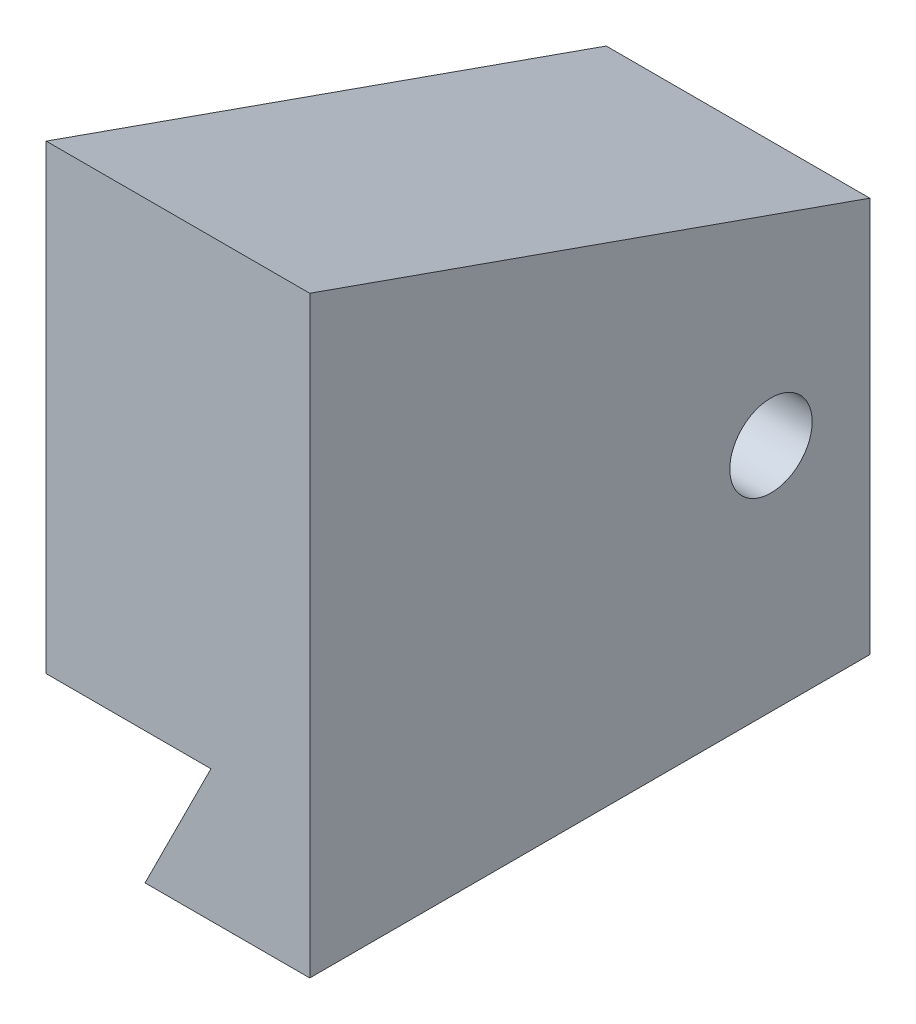
ISO-10303-21;
HEADER;
FILE_DESCRIPTION(('STEP AP214'),'2;1');
FILE_NAME('part.step','',(''),(''),'','','');
FILE_SCHEMA(('AUTOMOTIVE_DESIGN { 1 0 10303 214 1 1 1 1 }'));
ENDSEC;
DATA;
#1=APPLICATION_CONTEXT('core data for automotive mechanical design processes');
#2=APPLICATION_PROTOCOL_DEFINITION('international standard','automotive_design',2000,#1);
#3=PRODUCT_CONTEXT('',#1,'mechanical');
#4=PRODUCT('Part','Part','',(#3));
#5=PRODUCT_RELATED_PRODUCT_CATEGORY('part','',(#4));
#6=PRODUCT_DEFINITION_FORMATION('','',#4);
#7=PRODUCT_DEFINITION_CONTEXT('part definition',#1,'design');
#8=PRODUCT_DEFINITION('design','',#6,#7);
#9=PRODUCT_DEFINITION_SHAPE('','',#8);
#10=(LENGTH_UNIT() NAMED_UNIT(*) SI_UNIT(.MILLI.,.METRE.));
#11=(NAMED_UNIT(*) PLANE_ANGLE_UNIT() SI_UNIT($,.RADIAN.));
#12=(NAMED_UNIT(*) SI_UNIT($,.STERADIAN.) SOLID_ANGLE_UNIT());
#13=UNCERTAINTY_MEASURE_WITH_UNIT(LENGTH_MEASURE(1.E-05),#10,'distance_accuracy_value','');
#14=(GEOMETRIC_REPRESENTATION_CONTEXT(3) GLOBAL_UNCERTAINTY_ASSIGNED_CONTEXT((#13)) GLOBAL_UNIT_ASSIGNED_CONTEXT((#10,
#11,#12)) REPRESENTATION_CONTEXT('',''));
#15=CARTESIAN_POINT('',(0.,0.,0.));
#16=DIRECTION('',(0.,0.,1.));
#17=DIRECTION('',(1.,0.,0.));
#18=AXIS2_PLACEMENT_3D('',#15,#16,#17);
#19=CARTESIAN_POINT('',(8.,0.,17.));
#20=DIRECTION('',(0.,1.,0.));
#21=DIRECTION('',(0.,0.,1.));
#22=AXIS2_PLACEMENT_3D('',#19,#20,#21);
#23=PLANE('',#22);
#24=DIRECTION('',(0.,0.,-1.));
#25=VECTOR('',#24,1.);
#26=CARTESIAN_POINT('',(0.,0.,17.));
#27=LINE('',#26,#25);
#28=CARTESIAN_POINT('',(0.,0.,17.));
#29=VERTEX_POINT('',#28);
#30=CARTESIAN_POINT('',(0.,0.,0.));
#31=VERTEX_POINT('',#30);
#32=EDGE_CURVE('E136',#29,#31,#27,.T.);
#33=ORIENTED_EDGE('',*,*,#32,.F.);
#34=DIRECTION('',(-1.,0.,0.));
#35=VECTOR('',#34,1.);
#36=CARTESIAN_POINT('',(8.,0.,17.));
#37=LINE('',#36,#35);
#38=CARTESIAN_POINT('',(-5.,0.,17.));
#39=VERTEX_POINT('',#38);
#40=EDGE_CURVE('E101',#29,#39,#37,.T.);
#41=ORIENTED_EDGE('',*,*,#40,.T.);
#42=DIRECTION('',(0.,0.,-1.));
#43=VECTOR('',#42,1.);
#44=CARTESIAN_POINT('',(-5.,0.,17.));
#45=LINE('',#44,#43);
#46=CARTESIAN_POINT('',(-5.,0.,0.));
#47=VERTEX_POINT('',#46);
#48=EDGE_CURVE('E117',#39,#47,#45,.T.);
#49=ORIENTED_EDGE('',*,*,#48,.T.);
#50=DIRECTION('',(-1.,0.,0.));
#51=VECTOR('',#50,1.);
#52=CARTESIAN_POINT('',(8.,0.,0.));
#53=LINE('',#52,#51);
#54=EDGE_CURVE('E11',#31,#47,#53,.T.);
#55=ORIENTED_EDGE('',*,*,#54,.F.);
#56=EDGE_LOOP('',(#33,#41,#49,#55));
#57=FACE_BOUND('',#56,.T.);
#58=ADVANCED_FACE('F35',(#57),#23,.F.);
#59=CARTESIAN_POINT('',(8.,0.,0.));
#60=DIRECTION('',(0.,0.,1.));
#61=DIRECTION('',(1.,0.,0.));
#62=AXIS2_PLACEMENT_3D('',#59,#60,#61);
#63=PLANE('',#62);
#64=DIRECTION('',(0.,1.,0.));
#65=VECTOR('',#64,1.);
#66=CARTESIAN_POINT('',(0.,0.,0.));
#67=LINE('',#66,#65);
#68=CARTESIAN_POINT('',(0.,12.,0.));
#69=VERTEX_POINT('',#68);
#70=EDGE_CURVE('E50',#31,#69,#67,.T.);
#71=ORIENTED_EDGE('',*,*,#70,.F.);
#72=ORIENTED_EDGE('',*,*,#54,.T.);
#73=DIRECTION('',(0.447213595499958,0.894427190999916,0.));
#74=VECTOR('',#73,1.);
#75=CARTESIAN_POINT('',(-5.,0.,0.));
#76=LINE('',#75,#74);
#77=CARTESIAN_POINT('',(-3.,4.,0.));
#78=VERTEX_POINT('',#77);
#79=EDGE_CURVE('E125',#47,#78,#76,.T.);
#80=ORIENTED_EDGE('',*,*,#79,.T.);
#81=DIRECTION('',(-1.,0.,0.));
#82=VECTOR('',#81,1.);
#83=CARTESIAN_POINT('',(-3.,4.,0.));
#84=LINE('',#83,#82);
#85=CARTESIAN_POINT('',(-8.,4.,0.));
#86=VERTEX_POINT('',#85);
#87=EDGE_CURVE('E128',#78,#86,#84,.T.);
#88=ORIENTED_EDGE('',*,*,#87,.T.);
#89=DIRECTION('',(0.,1.,0.));
#90=VECTOR('',#89,1.);
#91=CARTESIAN_POINT('',(-8.,0.,0.));
#92=LINE('',#91,#90);
#93=CARTESIAN_POINT('',(-8.,12.,0.));
#94=VERTEX_POINT('',#93);
#95=EDGE_CURVE('E109',#86,#94,#92,.T.);
#96=ORIENTED_EDGE('',*,*,#95,.T.);
#97=DIRECTION('',(-1.,0.,0.));
#98=VECTOR('',#97,1.);
#99=CARTESIAN_POINT('',(8.,12.,0.));
#100=LINE('',#99,#98);
#101=EDGE_CURVE('E43',#69,#94,#100,.T.);
#102=ORIENTED_EDGE('',*,*,#101,.F.);
#103=EDGE_LOOP('',(#71,#72,#80,#88,#96,#102));
#104=FACE_BOUND('',#103,.T.);
#105=ADVANCED_FACE('F141',(#104),#63,.F.);
#106=CARTESIAN_POINT('',(8.,18.,17.));
#107=DIRECTION('',(0.,0.,-1.));
#108=DIRECTION('',(0.,1.,0.));
#109=AXIS2_PLACEMENT_3D('',#106,#107,#108);
#110=PLANE('',#109);
#111=DIRECTION('',(0.,-1.,0.));
#112=VECTOR('',#111,1.);
#113=CARTESIAN_POINT('',(0.,18.,17.));
#114=LINE('',#113,#112);
#115=CARTESIAN_POINT('',(0.,18.,17.));
#116=VERTEX_POINT('',#115);
#117=EDGE_CURVE('E88',#116,#29,#114,.T.);
#118=ORIENTED_EDGE('',*,*,#117,.F.);
#119=DIRECTION('',(-1.,0.,0.));
#120=VECTOR('',#119,1.);
#121=CARTESIAN_POINT('',(8.,18.,17.));
#122=LINE('',#121,#120);
#123=CARTESIAN_POINT('',(-8.,18.,17.));
#124=VERTEX_POINT('',#123);
#125=EDGE_CURVE('E98',#116,#124,#122,.T.);
#126=ORIENTED_EDGE('',*,*,#125,.T.);
#127=DIRECTION('',(0.,-1.,0.));
#128=VECTOR('',#127,1.);
#129=CARTESIAN_POINT('',(-8.,18.,17.));
#130=LINE('',#129,#128);
#131=CARTESIAN_POINT('',(-8.,4.,17.));
#132=VERTEX_POINT('',#131);
#133=EDGE_CURVE('E115',#124,#132,#130,.T.);
#134=ORIENTED_EDGE('',*,*,#133,.T.);
#135=DIRECTION('',(-1.,0.,0.));
#136=VECTOR('',#135,1.);
#137=CARTESIAN_POINT('',(-3.,4.,17.));
#138=LINE('',#137,#136);
#139=CARTESIAN_POINT('',(-3.,4.,17.));
#140=VERTEX_POINT('',#139);
#141=EDGE_CURVE('E58',#140,#132,#138,.T.);
#142=ORIENTED_EDGE('',*,*,#141,.F.);
#143=DIRECTION('',(0.447213595499958,0.894427190999916,0.));
#144=VECTOR('',#143,1.);
#145=CARTESIAN_POINT('',(-5.,0.,17.));
#146=LINE('',#145,#144);
#147=EDGE_CURVE('E121',#39,#140,#146,.T.);
#148=ORIENTED_EDGE('',*,*,#147,.F.);
#149=ORIENTED_EDGE('',*,*,#40,.F.);
#150=EDGE_LOOP('',(#118,#126,#134,#142,#148,#149));
#151=FACE_BOUND('',#150,.T.);
#152=ADVANCED_FACE('F96',(#151),#110,.F.);
#153=CARTESIAN_POINT('',(8.,12.,0.));
#154=DIRECTION('',(0.,-0.94299033358289,0.332820117735137));
#155=DIRECTION('',(0.,-0.332820117735137,-0.94299033358289));
#156=AXIS2_PLACEMENT_3D('',#153,#154,#155);
#157=PLANE('',#156);
#158=DIRECTION('',(0.,0.332820117735137,0.94299033358289));
#159=VECTOR('',#158,1.);
#160=CARTESIAN_POINT('',(0.,12.,0.));
#161=LINE('',#160,#159);
#162=EDGE_CURVE('E85',#69,#116,#161,.T.);
#163=ORIENTED_EDGE('',*,*,#162,.F.);
#164=ORIENTED_EDGE('',*,*,#101,.T.);
#165=DIRECTION('',(0.,0.332820117735137,0.94299033358289));
#166=VECTOR('',#165,1.);
#167=CARTESIAN_POINT('',(-8.,12.,0.));
#168=LINE('',#167,#166);
#169=EDGE_CURVE('E106',#94,#124,#168,.T.);
#170=ORIENTED_EDGE('',*,*,#169,.T.);
#171=ORIENTED_EDGE('',*,*,#125,.F.);
#172=EDGE_LOOP('',(#163,#164,#170,#171));
#173=FACE_BOUND('',#172,.T.);
#174=ADVANCED_FACE('F104',(#173),#157,.F.);
#175=CARTESIAN_POINT('',(8.,7.,3.));
#176=DIRECTION('',(1.,0.,0.));
#177=DIRECTION('',(0.,0.,-1.));
#178=AXIS2_PLACEMENT_3D('',#175,#176,#177);
#179=CYLINDRICAL_SURFACE('',#178,1.24999999999999);
#180=CARTESIAN_POINT('',(-8.,7.,3.));
#181=DIRECTION('',(-1.,0.,0.));
#182=DIRECTION('',(0.,0.,1.));
#183=AXIS2_PLACEMENT_3D('',#180,#181,#182);
#184=CIRCLE('',#183,1.24999999999999);
#185=CARTESIAN_POINT('',(-8.,7.,4.24999999999999));
#186=VERTEX_POINT('',#185);
#187=EDGE_CURVE('E131',#186,#186,#184,.T.);
#188=ORIENTED_EDGE('',*,*,#187,.T.);
#189=EDGE_LOOP('',(#188));
#190=FACE_BOUND('',#189,.T.);
#191=CARTESIAN_POINT('',(0.,7.,3.));
#192=DIRECTION('',(1.,0.,0.));
#193=DIRECTION('',(0.,0.,-1.));
#194=AXIS2_PLACEMENT_3D('',#191,#192,#193);
#195=CIRCLE('',#194,1.24999999999999);
#196=CARTESIAN_POINT('',(0.,7.,1.75000000000001));
#197=VERTEX_POINT('',#196);
#198=EDGE_CURVE('E38',#197,#197,#195,.F.);
#199=ORIENTED_EDGE('',*,*,#198,.F.);
#200=EDGE_LOOP('',(#199));
#201=FACE_BOUND('',#200,.T.);
#202=ADVANCED_FACE('F171',(#190,#201),#179,.F.);
#203=CARTESIAN_POINT('',(-8.,0.,0.));
#204=DIRECTION('',(-1.,0.,0.));
#205=DIRECTION('',(0.,0.,-1.));
#206=AXIS2_PLACEMENT_3D('',#203,#204,#205);
#207=PLANE('',#206);
#208=ORIENTED_EDGE('',*,*,#187,.F.);
#209=EDGE_LOOP('',(#208));
#210=FACE_BOUND('',#209,.T.);
#211=ORIENTED_EDGE('',*,*,#95,.F.);
#212=DIRECTION('',(0.,0.,-1.));
#213=VECTOR('',#212,1.);
#214=CARTESIAN_POINT('',(-8.,4.,17.));
#215=LINE('',#214,#213);
#216=EDGE_CURVE('E118',#132,#86,#215,.T.);
#217=ORIENTED_EDGE('',*,*,#216,.F.);
#218=ORIENTED_EDGE('',*,*,#133,.F.);
#219=ORIENTED_EDGE('',*,*,#169,.F.);
#220=EDGE_LOOP('',(#211,#217,#218,#219));
#221=FACE_BOUND('',#220,.T.);
#222=ADVANCED_FACE('F148',(#210,#221),#207,.T.);
#223=CARTESIAN_POINT('',(-5.,0.,17.));
#224=DIRECTION('',(-0.894427190999916,0.447213595499958,0.));
#225=DIRECTION('',(-0.447213595499958,-0.894427190999916,0.));
#226=AXIS2_PLACEMENT_3D('',#223,#224,#225);
#227=PLANE('',#226);
#228=ORIENTED_EDGE('',*,*,#79,.F.);
#229=ORIENTED_EDGE('',*,*,#48,.F.);
#230=ORIENTED_EDGE('',*,*,#147,.T.);
#231=DIRECTION('',(0.,0.,-1.));
#232=VECTOR('',#231,1.);
#233=CARTESIAN_POINT('',(-3.,4.,17.));
#234=LINE('',#233,#232);
#235=EDGE_CURVE('E120',#140,#78,#234,.T.);
#236=ORIENTED_EDGE('',*,*,#235,.T.);
#237=EDGE_LOOP('',(#228,#229,#230,#236));
#238=FACE_BOUND('',#237,.T.);
#239=ADVANCED_FACE('F145',(#238),#227,.T.);
#240=CARTESIAN_POINT('',(-3.,4.,17.));
#241=DIRECTION('',(0.,-1.,0.));
#242=DIRECTION('',(0.,0.,-1.));
#243=AXIS2_PLACEMENT_3D('',#240,#241,#242);
#244=PLANE('',#243);
#245=ORIENTED_EDGE('',*,*,#87,.F.);
#246=ORIENTED_EDGE('',*,*,#235,.F.);
#247=ORIENTED_EDGE('',*,*,#141,.T.);
#248=ORIENTED_EDGE('',*,*,#216,.T.);
#249=EDGE_LOOP('',(#245,#246,#247,#248));
#250=FACE_BOUND('',#249,.T.);
#251=ADVANCED_FACE('F150',(#250),#244,.T.);
#252=CARTESIAN_POINT('',(0.,0.,0.));
#253=DIRECTION('',(1.,0.,0.));
#254=DIRECTION('',(0.,0.,-1.));
#255=AXIS2_PLACEMENT_3D('',#252,#253,#254);
#256=PLANE('',#255);
#257=ORIENTED_EDGE('',*,*,#198,.T.);
#258=EDGE_LOOP('',(#257));
#259=FACE_BOUND('',#258,.T.);
#260=ORIENTED_EDGE('',*,*,#32,.T.);
#261=ORIENTED_EDGE('',*,*,#70,.T.);
#262=ORIENTED_EDGE('',*,*,#162,.T.);
#263=ORIENTED_EDGE('',*,*,#117,.T.);
#264=EDGE_LOOP('',(#260,#261,#262,#263));
#265=FACE_BOUND('',#264,.T.);
#266=ADVANCED_FACE('F87',(#259,#265),#256,.T.);
#267=CLOSED_SHELL('',(#58,#105,#152,#174,#202,#222,#239,#251,#266));
#268=MANIFOLD_SOLID_BREP('B2',#267);
#269=ADVANCED_BREP_SHAPE_REPRESENTATION('',(#18,#268),#14);
#270=SHAPE_DEFINITION_REPRESENTATION(#9,#269);
ENDSEC;
END-ISO-10303-21;
